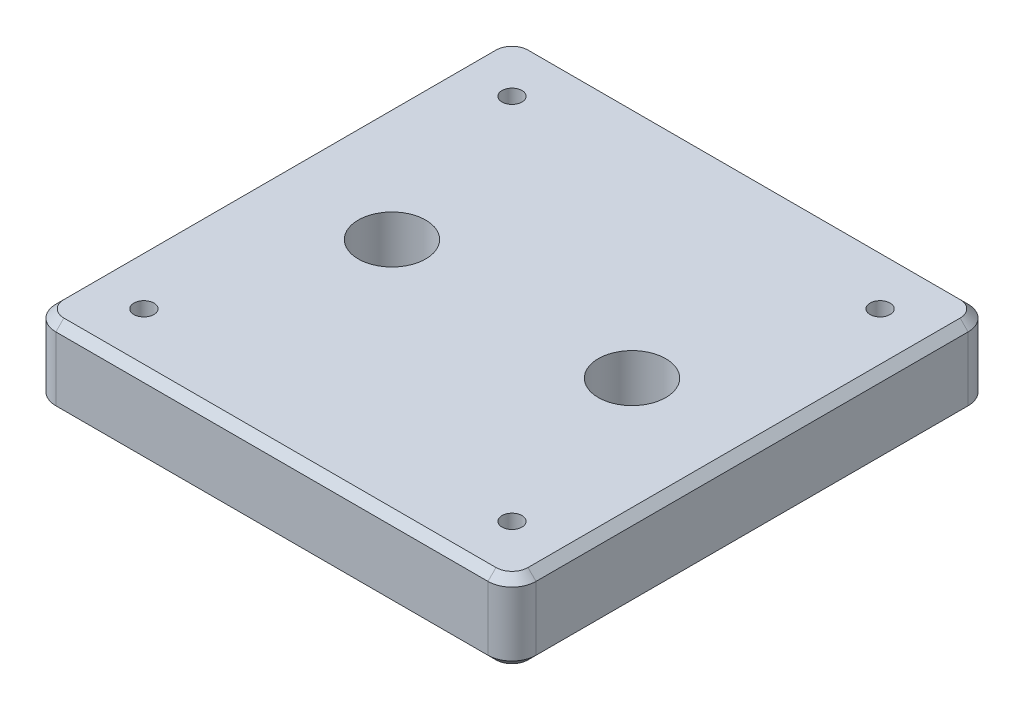
ISO-10303-21;
HEADER;
FILE_DESCRIPTION(('STEP AP214'),'2;1');
FILE_NAME('part.step','',(''),(''),'','','');
FILE_SCHEMA(('AUTOMOTIVE_DESIGN { 1 0 10303 214 1 1 1 1 }'));
ENDSEC;
DATA;
#1=APPLICATION_CONTEXT('core data for automotive mechanical design processes');
#2=APPLICATION_PROTOCOL_DEFINITION('international standard','automotive_design',2000,#1);
#3=PRODUCT_CONTEXT('',#1,'mechanical');
#4=PRODUCT('Part','Part','',(#3));
#5=PRODUCT_RELATED_PRODUCT_CATEGORY('part','',(#4));
#6=PRODUCT_DEFINITION_FORMATION('','',#4);
#7=PRODUCT_DEFINITION_CONTEXT('part definition',#1,'design');
#8=PRODUCT_DEFINITION('design','',#6,#7);
#9=PRODUCT_DEFINITION_SHAPE('','',#8);
#10=(LENGTH_UNIT() NAMED_UNIT(*) SI_UNIT(.MILLI.,.METRE.));
#11=(NAMED_UNIT(*) PLANE_ANGLE_UNIT() SI_UNIT($,.RADIAN.));
#12=(NAMED_UNIT(*) SI_UNIT($,.STERADIAN.) SOLID_ANGLE_UNIT());
#13=UNCERTAINTY_MEASURE_WITH_UNIT(LENGTH_MEASURE(1.E-05),#10,'distance_accuracy_value','');
#14=(GEOMETRIC_REPRESENTATION_CONTEXT(3) GLOBAL_UNCERTAINTY_ASSIGNED_CONTEXT((#13)) GLOBAL_UNIT_ASSIGNED_CONTEXT((#10,
#11,#12)) REPRESENTATION_CONTEXT('',''));
#15=CARTESIAN_POINT('',(0.,0.,0.));
#16=DIRECTION('',(0.,0.,1.));
#17=DIRECTION('',(1.,0.,0.));
#18=AXIS2_PLACEMENT_3D('',#15,#16,#17);
#19=CARTESIAN_POINT('',(30.,10.,30.));
#20=DIRECTION('',(-1.,0.,0.));
#21=DIRECTION('',(0.,0.,1.));
#22=AXIS2_PLACEMENT_3D('',#19,#20,#21);
#23=PLANE('',#22);
#24=DIRECTION('',(0.,-1.,0.));
#25=VECTOR('',#24,1.);
#26=CARTESIAN_POINT('',(30.,10.,-27.));
#27=LINE('',#26,#25);
#28=CARTESIAN_POINT('',(30.,0.999999999999994,-27.));
#29=VERTEX_POINT('',#28);
#30=CARTESIAN_POINT('',(30.,9.00000000000001,-27.));
#31=VERTEX_POINT('',#30);
#32=EDGE_CURVE('E327',#29,#31,#27,.F.);
#33=ORIENTED_EDGE('',*,*,#32,.T.);
#34=DIRECTION('',(0.,0.,1.));
#35=VECTOR('',#34,1.);
#36=CARTESIAN_POINT('',(30.,9.00000000000001,30.));
#37=LINE('',#36,#35);
#38=CARTESIAN_POINT('',(30.,9.00000000000001,27.));
#39=VERTEX_POINT('',#38);
#40=EDGE_CURVE('E306',#31,#39,#37,.T.);
#41=ORIENTED_EDGE('',*,*,#40,.T.);
#42=DIRECTION('',(0.,-1.,0.));
#43=VECTOR('',#42,1.);
#44=CARTESIAN_POINT('',(30.,10.,27.));
#45=LINE('',#44,#43);
#46=CARTESIAN_POINT('',(30.,0.999999999999994,27.));
#47=VERTEX_POINT('',#46);
#48=EDGE_CURVE('E330',#39,#47,#45,.T.);
#49=ORIENTED_EDGE('',*,*,#48,.T.);
#50=DIRECTION('',(0.,0.,-1.));
#51=VECTOR('',#50,1.);
#52=CARTESIAN_POINT('',(30.,0.999999999999994,-27.));
#53=LINE('',#52,#51);
#54=EDGE_CURVE('E309',#47,#29,#53,.T.);
#55=ORIENTED_EDGE('',*,*,#54,.T.);
#56=EDGE_LOOP('',(#33,#41,#49,#55));
#57=FACE_BOUND('',#56,.T.);
#58=ADVANCED_FACE('F49',(#57),#23,.F.);
#59=CARTESIAN_POINT('',(-30.,10.,-30.));
#60=DIRECTION('',(0.,0.,1.));
#61=DIRECTION('',(1.,0.,0.));
#62=AXIS2_PLACEMENT_3D('',#59,#60,#61);
#63=PLANE('',#62);
#64=DIRECTION('',(0.,-1.,0.));
#65=VECTOR('',#64,1.);
#66=CARTESIAN_POINT('',(-27.,10.,-30.));
#67=LINE('',#66,#65);
#68=CARTESIAN_POINT('',(-27.,0.999999999999994,-30.));
#69=VERTEX_POINT('',#68);
#70=CARTESIAN_POINT('',(-27.,9.00000000000001,-30.));
#71=VERTEX_POINT('',#70);
#72=EDGE_CURVE('E332',#69,#71,#67,.F.);
#73=ORIENTED_EDGE('',*,*,#72,.T.);
#74=DIRECTION('',(1.,0.,0.));
#75=VECTOR('',#74,1.);
#76=CARTESIAN_POINT('',(-30.,9.00000000000001,-30.));
#77=LINE('',#76,#75);
#78=CARTESIAN_POINT('',(27.,9.00000000000001,-30.));
#79=VERTEX_POINT('',#78);
#80=EDGE_CURVE('E246',#71,#79,#77,.T.);
#81=ORIENTED_EDGE('',*,*,#80,.T.);
#82=DIRECTION('',(0.,-1.,0.));
#83=VECTOR('',#82,1.);
#84=CARTESIAN_POINT('',(27.,10.,-30.));
#85=LINE('',#84,#83);
#86=CARTESIAN_POINT('',(27.,0.999999999999994,-30.));
#87=VERTEX_POINT('',#86);
#88=EDGE_CURVE('E334',#79,#87,#85,.T.);
#89=ORIENTED_EDGE('',*,*,#88,.T.);
#90=DIRECTION('',(-1.,0.,0.));
#91=VECTOR('',#90,1.);
#92=CARTESIAN_POINT('',(-27.,0.999999999999994,-30.));
#93=LINE('',#92,#91);
#94=EDGE_CURVE('E253',#87,#69,#93,.T.);
#95=ORIENTED_EDGE('',*,*,#94,.T.);
#96=EDGE_LOOP('',(#73,#81,#89,#95));
#97=FACE_BOUND('',#96,.T.);
#98=ADVANCED_FACE('F423',(#97),#63,.F.);
#99=CARTESIAN_POINT('',(-30.,10.,30.));
#100=DIRECTION('',(1.,0.,0.));
#101=DIRECTION('',(0.,0.,-1.));
#102=AXIS2_PLACEMENT_3D('',#99,#100,#101);
#103=PLANE('',#102);
#104=DIRECTION('',(0.,-1.,0.));
#105=VECTOR('',#104,1.);
#106=CARTESIAN_POINT('',(-30.,10.,27.));
#107=LINE('',#106,#105);
#108=CARTESIAN_POINT('',(-30.,0.999999999999994,27.));
#109=VERTEX_POINT('',#108);
#110=CARTESIAN_POINT('',(-30.,9.00000000000001,27.));
#111=VERTEX_POINT('',#110);
#112=EDGE_CURVE('E339',#109,#111,#107,.F.);
#113=ORIENTED_EDGE('',*,*,#112,.T.);
#114=DIRECTION('',(0.,0.,-1.));
#115=VECTOR('',#114,1.);
#116=CARTESIAN_POINT('',(-30.,9.00000000000001,30.));
#117=LINE('',#116,#115);
#118=CARTESIAN_POINT('',(-30.,9.00000000000001,-27.));
#119=VERTEX_POINT('',#118);
#120=EDGE_CURVE('E271',#111,#119,#117,.T.);
#121=ORIENTED_EDGE('',*,*,#120,.T.);
#122=DIRECTION('',(0.,-1.,0.));
#123=VECTOR('',#122,1.);
#124=CARTESIAN_POINT('',(-30.,10.,-27.));
#125=LINE('',#124,#123);
#126=CARTESIAN_POINT('',(-30.,0.999999999999994,-27.));
#127=VERTEX_POINT('',#126);
#128=EDGE_CURVE('E336',#119,#127,#125,.T.);
#129=ORIENTED_EDGE('',*,*,#128,.T.);
#130=DIRECTION('',(0.,0.,1.));
#131=VECTOR('',#130,1.);
#132=CARTESIAN_POINT('',(-30.,0.999999999999994,27.));
#133=LINE('',#132,#131);
#134=EDGE_CURVE('E269',#127,#109,#133,.T.);
#135=ORIENTED_EDGE('',*,*,#134,.T.);
#136=EDGE_LOOP('',(#113,#121,#129,#135));
#137=FACE_BOUND('',#136,.T.);
#138=ADVANCED_FACE('F430',(#137),#103,.F.);
#139=CARTESIAN_POINT('',(-30.,10.,30.));
#140=DIRECTION('',(0.,0.,-1.));
#141=DIRECTION('',(-1.,0.,0.));
#142=AXIS2_PLACEMENT_3D('',#139,#140,#141);
#143=PLANE('',#142);
#144=DIRECTION('',(0.,-1.,0.));
#145=VECTOR('',#144,1.);
#146=CARTESIAN_POINT('',(27.,10.,30.));
#147=LINE('',#146,#145);
#148=CARTESIAN_POINT('',(27.,0.999999999999994,30.));
#149=VERTEX_POINT('',#148);
#150=CARTESIAN_POINT('',(27.,9.00000000000001,30.));
#151=VERTEX_POINT('',#150);
#152=EDGE_CURVE('E188',#149,#151,#147,.F.);
#153=ORIENTED_EDGE('',*,*,#152,.T.);
#154=DIRECTION('',(-1.,0.,0.));
#155=VECTOR('',#154,1.);
#156=CARTESIAN_POINT('',(-30.,9.00000000000001,30.));
#157=LINE('',#156,#155);
#158=CARTESIAN_POINT('',(-27.,9.00000000000001,30.));
#159=VERTEX_POINT('',#158);
#160=EDGE_CURVE('E255',#151,#159,#157,.T.);
#161=ORIENTED_EDGE('',*,*,#160,.T.);
#162=DIRECTION('',(0.,-1.,0.));
#163=VECTOR('',#162,1.);
#164=CARTESIAN_POINT('',(-27.,10.,30.));
#165=LINE('',#164,#163);
#166=CARTESIAN_POINT('',(-27.,0.999999999999994,30.));
#167=VERTEX_POINT('',#166);
#168=EDGE_CURVE('E324',#159,#167,#165,.T.);
#169=ORIENTED_EDGE('',*,*,#168,.T.);
#170=DIRECTION('',(1.,0.,0.));
#171=VECTOR('',#170,1.);
#172=CARTESIAN_POINT('',(27.,0.999999999999994,30.));
#173=LINE('',#172,#171);
#174=EDGE_CURVE('E252',#167,#149,#173,.T.);
#175=ORIENTED_EDGE('',*,*,#174,.T.);
#176=EDGE_LOOP('',(#153,#161,#169,#175));
#177=FACE_BOUND('',#176,.T.);
#178=ADVANCED_FACE('F393',(#177),#143,.F.);
#179=CARTESIAN_POINT('',(0.,10.,0.));
#180=DIRECTION('',(0.,-1.,0.));
#181=DIRECTION('',(0.,0.,-1.));
#182=AXIS2_PLACEMENT_3D('',#179,#180,#181);
#183=PLANE('',#182);
#184=CARTESIAN_POINT('',(27.,10.,27.));
#185=DIRECTION('',(0.,-1.,0.));
#186=DIRECTION('',(0.,0.,-1.));
#187=AXIS2_PLACEMENT_3D('',#184,#185,#186);
#188=CIRCLE('',#187,2.00000000000001);
#189=CARTESIAN_POINT('',(27.,10.,29.));
#190=VERTEX_POINT('',#189);
#191=CARTESIAN_POINT('',(29.,10.,27.));
#192=VERTEX_POINT('',#191);
#193=EDGE_CURVE('E317',#190,#192,#188,.F.);
#194=ORIENTED_EDGE('',*,*,#193,.T.);
#195=DIRECTION('',(0.,0.,-1.));
#196=VECTOR('',#195,1.);
#197=CARTESIAN_POINT('',(29.,10.,0.));
#198=LINE('',#197,#196);
#199=CARTESIAN_POINT('',(29.,10.,-27.));
#200=VERTEX_POINT('',#199);
#201=EDGE_CURVE('E312',#192,#200,#198,.T.);
#202=ORIENTED_EDGE('',*,*,#201,.T.);
#203=CARTESIAN_POINT('',(27.,10.,-27.));
#204=DIRECTION('',(0.,-1.,0.));
#205=DIRECTION('',(0.,0.,-1.));
#206=AXIS2_PLACEMENT_3D('',#203,#204,#205);
#207=CIRCLE('',#206,2.00000000000001);
#208=CARTESIAN_POINT('',(27.,10.,-29.));
#209=VERTEX_POINT('',#208);
#210=EDGE_CURVE('E315',#200,#209,#207,.F.);
#211=ORIENTED_EDGE('',*,*,#210,.T.);
#212=DIRECTION('',(-1.,0.,0.));
#213=VECTOR('',#212,1.);
#214=CARTESIAN_POINT('',(0.,10.,-29.));
#215=LINE('',#214,#213);
#216=CARTESIAN_POINT('',(-27.,10.,-29.));
#217=VERTEX_POINT('',#216);
#218=EDGE_CURVE('E171',#209,#217,#215,.T.);
#219=ORIENTED_EDGE('',*,*,#218,.T.);
#220=CARTESIAN_POINT('',(-27.,10.,-27.));
#221=DIRECTION('',(0.,-1.,0.));
#222=DIRECTION('',(0.,0.,-1.));
#223=AXIS2_PLACEMENT_3D('',#220,#221,#222);
#224=CIRCLE('',#223,2.00000000000001);
#225=CARTESIAN_POINT('',(-29.,10.,-27.));
#226=VERTEX_POINT('',#225);
#227=EDGE_CURVE('E164',#217,#226,#224,.F.);
#228=ORIENTED_EDGE('',*,*,#227,.T.);
#229=DIRECTION('',(0.,0.,1.));
#230=VECTOR('',#229,1.);
#231=CARTESIAN_POINT('',(-29.,10.,0.));
#232=LINE('',#231,#230);
#233=CARTESIAN_POINT('',(-29.,10.,27.));
#234=VERTEX_POINT('',#233);
#235=EDGE_CURVE('E168',#226,#234,#232,.T.);
#236=ORIENTED_EDGE('',*,*,#235,.T.);
#237=CARTESIAN_POINT('',(-27.,10.,27.));
#238=DIRECTION('',(0.,-1.,0.));
#239=DIRECTION('',(0.,0.,-1.));
#240=AXIS2_PLACEMENT_3D('',#237,#238,#239);
#241=CIRCLE('',#240,2.00000000000001);
#242=CARTESIAN_POINT('',(-27.,10.,29.));
#243=VERTEX_POINT('',#242);
#244=EDGE_CURVE('E177',#234,#243,#241,.F.);
#245=ORIENTED_EDGE('',*,*,#244,.T.);
#246=DIRECTION('',(1.,0.,0.));
#247=VECTOR('',#246,1.);
#248=CARTESIAN_POINT('',(0.,10.,29.));
#249=LINE('',#248,#247);
#250=EDGE_CURVE('E176',#243,#190,#249,.T.);
#251=ORIENTED_EDGE('',*,*,#250,.T.);
#252=EDGE_LOOP('',(#194,#202,#211,#219,#228,#236,#245,#251));
#253=FACE_BOUND('',#252,.T.);
#254=CARTESIAN_POINT('',(-15.,10.,0.));
#255=DIRECTION('',(0.,1.,0.));
#256=DIRECTION('',(0.,0.,1.));
#257=AXIS2_PLACEMENT_3D('',#254,#255,#256);
#258=CIRCLE('',#257,4.2164);
#259=CARTESIAN_POINT('',(-15.,10.,4.2164));
#260=VERTEX_POINT('',#259);
#261=EDGE_CURVE('E194',#260,#260,#258,.T.);
#262=ORIENTED_EDGE('',*,*,#261,.F.);
#263=EDGE_LOOP('',(#262));
#264=FACE_BOUND('',#263,.T.);
#265=CARTESIAN_POINT('',(15.,10.,0.));
#266=DIRECTION('',(0.,1.,0.));
#267=DIRECTION('',(0.,0.,1.));
#268=AXIS2_PLACEMENT_3D('',#265,#266,#267);
#269=CIRCLE('',#268,4.2164);
#270=CARTESIAN_POINT('',(15.,10.,4.2164));
#271=VERTEX_POINT('',#270);
#272=EDGE_CURVE('E375',#271,#271,#269,.T.);
#273=ORIENTED_EDGE('',*,*,#272,.F.);
#274=EDGE_LOOP('',(#273));
#275=FACE_BOUND('',#274,.T.);
#276=CARTESIAN_POINT('',(23.,10.,-23.));
#277=DIRECTION('',(0.,1.,0.));
#278=DIRECTION('',(0.,0.,1.));
#279=AXIS2_PLACEMENT_3D('',#276,#277,#278);
#280=CIRCLE('',#279,1.24999999999999);
#281=CARTESIAN_POINT('',(23.,10.,-21.75));
#282=VERTEX_POINT('',#281);
#283=EDGE_CURVE('E363',#282,#282,#280,.T.);
#284=ORIENTED_EDGE('',*,*,#283,.F.);
#285=EDGE_LOOP('',(#284));
#286=FACE_BOUND('',#285,.T.);
#287=CARTESIAN_POINT('',(-23.,10.,23.));
#288=DIRECTION('',(0.,1.,0.));
#289=DIRECTION('',(0.,0.,1.));
#290=AXIS2_PLACEMENT_3D('',#287,#288,#289);
#291=CIRCLE('',#290,1.24999999999999);
#292=CARTESIAN_POINT('',(-23.,10.,24.25));
#293=VERTEX_POINT('',#292);
#294=EDGE_CURVE('E357',#293,#293,#291,.T.);
#295=ORIENTED_EDGE('',*,*,#294,.F.);
#296=EDGE_LOOP('',(#295));
#297=FACE_BOUND('',#296,.T.);
#298=CARTESIAN_POINT('',(-23.,10.,-23.));
#299=DIRECTION('',(0.,1.,0.));
#300=DIRECTION('',(0.,0.,1.));
#301=AXIS2_PLACEMENT_3D('',#298,#299,#300);
#302=CIRCLE('',#301,1.24999999999999);
#303=CARTESIAN_POINT('',(-23.,10.,-21.75));
#304=VERTEX_POINT('',#303);
#305=EDGE_CURVE('E351',#304,#304,#302,.T.);
#306=ORIENTED_EDGE('',*,*,#305,.F.);
#307=EDGE_LOOP('',(#306));
#308=FACE_BOUND('',#307,.T.);
#309=CARTESIAN_POINT('',(23.,10.,23.));
#310=DIRECTION('',(0.,1.,0.));
#311=DIRECTION('',(0.,0.,1.));
#312=AXIS2_PLACEMENT_3D('',#309,#310,#311);
#313=CIRCLE('',#312,1.24999999999999);
#314=CARTESIAN_POINT('',(23.,10.,24.25));
#315=VERTEX_POINT('',#314);
#316=EDGE_CURVE('E345',#315,#315,#313,.T.);
#317=ORIENTED_EDGE('',*,*,#316,.F.);
#318=EDGE_LOOP('',(#317));
#319=FACE_BOUND('',#318,.T.);
#320=ADVANCED_FACE('F166',(#253,#264,#275,#286,#297,#308,#319),#183,.F.);
#321=CARTESIAN_POINT('',(0.,0.,0.));
#322=DIRECTION('',(0.,-1.,0.));
#323=DIRECTION('',(0.,0.,-1.));
#324=AXIS2_PLACEMENT_3D('',#321,#322,#323);
#325=PLANE('',#324);
#326=CARTESIAN_POINT('',(27.,0.,-27.));
#327=DIRECTION('',(0.,-1.,0.));
#328=DIRECTION('',(0.,0.,-1.));
#329=AXIS2_PLACEMENT_3D('',#326,#327,#328);
#330=CIRCLE('',#329,2.00000000000001);
#331=CARTESIAN_POINT('',(27.,0.,-29.));
#332=VERTEX_POINT('',#331);
#333=CARTESIAN_POINT('',(29.,0.,-27.));
#334=VERTEX_POINT('',#333);
#335=EDGE_CURVE('E59',#332,#334,#330,.T.);
#336=ORIENTED_EDGE('',*,*,#335,.T.);
#337=DIRECTION('',(0.,0.,1.));
#338=VECTOR('',#337,1.);
#339=CARTESIAN_POINT('',(29.,0.,27.));
#340=LINE('',#339,#338);
#341=CARTESIAN_POINT('',(29.,0.,27.));
#342=VERTEX_POINT('',#341);
#343=EDGE_CURVE('E11',#334,#342,#340,.T.);
#344=ORIENTED_EDGE('',*,*,#343,.T.);
#345=CARTESIAN_POINT('',(27.,0.,27.));
#346=DIRECTION('',(0.,-1.,0.));
#347=DIRECTION('',(0.,0.,-1.));
#348=AXIS2_PLACEMENT_3D('',#345,#346,#347);
#349=CIRCLE('',#348,2.00000000000001);
#350=CARTESIAN_POINT('',(27.,0.,29.));
#351=VERTEX_POINT('',#350);
#352=EDGE_CURVE('E283',#342,#351,#349,.T.);
#353=ORIENTED_EDGE('',*,*,#352,.T.);
#354=DIRECTION('',(-1.,0.,0.));
#355=VECTOR('',#354,1.);
#356=CARTESIAN_POINT('',(-27.,0.,29.));
#357=LINE('',#356,#355);
#358=CARTESIAN_POINT('',(-27.,0.,29.));
#359=VERTEX_POINT('',#358);
#360=EDGE_CURVE('E279',#351,#359,#357,.T.);
#361=ORIENTED_EDGE('',*,*,#360,.T.);
#362=CARTESIAN_POINT('',(-27.,0.,27.));
#363=DIRECTION('',(0.,-1.,0.));
#364=DIRECTION('',(0.,0.,-1.));
#365=AXIS2_PLACEMENT_3D('',#362,#363,#364);
#366=CIRCLE('',#365,2.00000000000001);
#367=CARTESIAN_POINT('',(-29.,0.,27.));
#368=VERTEX_POINT('',#367);
#369=EDGE_CURVE('E275',#359,#368,#366,.T.);
#370=ORIENTED_EDGE('',*,*,#369,.T.);
#371=DIRECTION('',(0.,0.,-1.));
#372=VECTOR('',#371,1.);
#373=CARTESIAN_POINT('',(-29.,0.,-27.));
#374=LINE('',#373,#372);
#375=CARTESIAN_POINT('',(-29.,0.,-27.));
#376=VERTEX_POINT('',#375);
#377=EDGE_CURVE('E273',#368,#376,#374,.T.);
#378=ORIENTED_EDGE('',*,*,#377,.T.);
#379=CARTESIAN_POINT('',(-27.,0.,-27.));
#380=DIRECTION('',(0.,-1.,0.));
#381=DIRECTION('',(0.,0.,-1.));
#382=AXIS2_PLACEMENT_3D('',#379,#380,#381);
#383=CIRCLE('',#382,2.00000000000001);
#384=CARTESIAN_POINT('',(-27.,0.,-29.));
#385=VERTEX_POINT('',#384);
#386=EDGE_CURVE('E277',#376,#385,#383,.T.);
#387=ORIENTED_EDGE('',*,*,#386,.T.);
#388=DIRECTION('',(1.,0.,0.));
#389=VECTOR('',#388,1.);
#390=CARTESIAN_POINT('',(27.,0.,-29.));
#391=LINE('',#390,#389);
#392=EDGE_CURVE('E281',#385,#332,#391,.T.);
#393=ORIENTED_EDGE('',*,*,#392,.T.);
#394=EDGE_LOOP('',(#336,#344,#353,#361,#370,#378,#387,#393));
#395=FACE_BOUND('',#394,.T.);
#396=CARTESIAN_POINT('',(-15.,0.,0.));
#397=DIRECTION('',(0.,1.,0.));
#398=DIRECTION('',(0.,0.,1.));
#399=AXIS2_PLACEMENT_3D('',#396,#397,#398);
#400=CIRCLE('',#399,2.24790000000001);
#401=CARTESIAN_POINT('',(-15.,0.,2.24790000000001));
#402=VERTEX_POINT('',#401);
#403=EDGE_CURVE('E378',#402,#402,#400,.T.);
#404=ORIENTED_EDGE('',*,*,#403,.T.);
#405=EDGE_LOOP('',(#404));
#406=FACE_BOUND('',#405,.T.);
#407=CARTESIAN_POINT('',(15.,0.,0.));
#408=DIRECTION('',(0.,1.,0.));
#409=DIRECTION('',(0.,0.,1.));
#410=AXIS2_PLACEMENT_3D('',#407,#408,#409);
#411=CIRCLE('',#410,2.24790000000001);
#412=CARTESIAN_POINT('',(15.,0.,2.24790000000001));
#413=VERTEX_POINT('',#412);
#414=EDGE_CURVE('E366',#413,#413,#411,.T.);
#415=ORIENTED_EDGE('',*,*,#414,.T.);
#416=EDGE_LOOP('',(#415));
#417=FACE_BOUND('',#416,.T.);
#418=CARTESIAN_POINT('',(23.,0.,-23.));
#419=DIRECTION('',(0.,1.,0.));
#420=DIRECTION('',(0.,0.,1.));
#421=AXIS2_PLACEMENT_3D('',#418,#419,#420);
#422=CIRCLE('',#421,1.24999999999999);
#423=CARTESIAN_POINT('',(23.,0.,-21.75));
#424=VERTEX_POINT('',#423);
#425=EDGE_CURVE('E360',#424,#424,#422,.T.);
#426=ORIENTED_EDGE('',*,*,#425,.T.);
#427=EDGE_LOOP('',(#426));
#428=FACE_BOUND('',#427,.T.);
#429=CARTESIAN_POINT('',(-23.,0.,23.));
#430=DIRECTION('',(0.,1.,0.));
#431=DIRECTION('',(0.,0.,1.));
#432=AXIS2_PLACEMENT_3D('',#429,#430,#431);
#433=CIRCLE('',#432,1.24999999999999);
#434=CARTESIAN_POINT('',(-23.,0.,24.25));
#435=VERTEX_POINT('',#434);
#436=EDGE_CURVE('E354',#435,#435,#433,.T.);
#437=ORIENTED_EDGE('',*,*,#436,.T.);
#438=EDGE_LOOP('',(#437));
#439=FACE_BOUND('',#438,.T.);
#440=CARTESIAN_POINT('',(-23.,0.,-23.));
#441=DIRECTION('',(0.,1.,0.));
#442=DIRECTION('',(0.,0.,1.));
#443=AXIS2_PLACEMENT_3D('',#440,#441,#442);
#444=CIRCLE('',#443,1.24999999999999);
#445=CARTESIAN_POINT('',(-23.,0.,-21.75));
#446=VERTEX_POINT('',#445);
#447=EDGE_CURVE('E348',#446,#446,#444,.T.);
#448=ORIENTED_EDGE('',*,*,#447,.T.);
#449=EDGE_LOOP('',(#448));
#450=FACE_BOUND('',#449,.T.);
#451=CARTESIAN_POINT('',(23.,0.,23.));
#452=DIRECTION('',(0.,1.,0.));
#453=DIRECTION('',(0.,0.,1.));
#454=AXIS2_PLACEMENT_3D('',#451,#452,#453);
#455=CIRCLE('',#454,1.24999999999999);
#456=CARTESIAN_POINT('',(23.,0.,24.25));
#457=VERTEX_POINT('',#456);
#458=EDGE_CURVE('E342',#457,#457,#455,.T.);
#459=ORIENTED_EDGE('',*,*,#458,.T.);
#460=EDGE_LOOP('',(#459));
#461=FACE_BOUND('',#460,.T.);
#462=ADVANCED_FACE('F285',(#395,#406,#417,#428,#439,#450,#461),#325,.T.);
#463=CARTESIAN_POINT('',(-27.,10.,-27.));
#464=DIRECTION('',(0.,-1.,0.));
#465=DIRECTION('',(0.,0.,-1.));
#466=AXIS2_PLACEMENT_3D('',#463,#464,#465);
#467=CYLINDRICAL_SURFACE('',#466,3.);
#468=ORIENTED_EDGE('',*,*,#128,.F.);
#469=CARTESIAN_POINT('',(-27.,9.00000000000001,-27.));
#470=DIRECTION('',(0.,-1.,0.));
#471=DIRECTION('',(0.,0.,-1.));
#472=AXIS2_PLACEMENT_3D('',#469,#470,#471);
#473=CIRCLE('',#472,3.);
#474=EDGE_CURVE('E191',#119,#71,#473,.T.);
#475=ORIENTED_EDGE('',*,*,#474,.T.);
#476=ORIENTED_EDGE('',*,*,#72,.F.);
#477=CARTESIAN_POINT('',(-27.,0.999999999999994,-27.));
#478=DIRECTION('',(0.,-1.,0.));
#479=DIRECTION('',(0.,0.,-1.));
#480=AXIS2_PLACEMENT_3D('',#477,#478,#479);
#481=CIRCLE('',#480,3.);
#482=EDGE_CURVE('E262',#69,#127,#481,.F.);
#483=ORIENTED_EDGE('',*,*,#482,.T.);
#484=EDGE_LOOP('',(#468,#475,#476,#483));
#485=FACE_BOUND('',#484,.T.);
#486=ADVANCED_FACE('F434',(#485),#467,.T.);
#487=CARTESIAN_POINT('',(27.,10.,-27.));
#488=DIRECTION('',(0.,-1.,0.));
#489=DIRECTION('',(0.,0.,-1.));
#490=AXIS2_PLACEMENT_3D('',#487,#488,#489);
#491=CYLINDRICAL_SURFACE('',#490,3.);
#492=ORIENTED_EDGE('',*,*,#88,.F.);
#493=CARTESIAN_POINT('',(27.,9.00000000000001,-27.));
#494=DIRECTION('',(0.,-1.,0.));
#495=DIRECTION('',(0.,0.,-1.));
#496=AXIS2_PLACEMENT_3D('',#493,#494,#495);
#497=CIRCLE('',#496,3.);
#498=EDGE_CURVE('E300',#79,#31,#497,.T.);
#499=ORIENTED_EDGE('',*,*,#498,.T.);
#500=ORIENTED_EDGE('',*,*,#32,.F.);
#501=CARTESIAN_POINT('',(27.,0.999999999999994,-27.));
#502=DIRECTION('',(0.,-1.,0.));
#503=DIRECTION('',(0.,0.,-1.));
#504=AXIS2_PLACEMENT_3D('',#501,#502,#503);
#505=CIRCLE('',#504,3.);
#506=EDGE_CURVE('E302',#29,#87,#505,.F.);
#507=ORIENTED_EDGE('',*,*,#506,.T.);
#508=EDGE_LOOP('',(#492,#499,#500,#507));
#509=FACE_BOUND('',#508,.T.);
#510=ADVANCED_FACE('F437',(#509),#491,.T.);
#511=CARTESIAN_POINT('',(27.,10.,27.));
#512=DIRECTION('',(0.,-1.,0.));
#513=DIRECTION('',(0.,0.,-1.));
#514=AXIS2_PLACEMENT_3D('',#511,#512,#513);
#515=CYLINDRICAL_SURFACE('',#514,3.);
#516=ORIENTED_EDGE('',*,*,#48,.F.);
#517=CARTESIAN_POINT('',(27.,9.00000000000001,27.));
#518=DIRECTION('',(0.,-1.,0.));
#519=DIRECTION('',(0.,0.,-1.));
#520=AXIS2_PLACEMENT_3D('',#517,#518,#519);
#521=CIRCLE('',#520,3.);
#522=EDGE_CURVE('E257',#39,#151,#521,.T.);
#523=ORIENTED_EDGE('',*,*,#522,.T.);
#524=ORIENTED_EDGE('',*,*,#152,.F.);
#525=CARTESIAN_POINT('',(27.,0.999999999999994,27.));
#526=DIRECTION('',(0.,-1.,0.));
#527=DIRECTION('',(0.,0.,-1.));
#528=AXIS2_PLACEMENT_3D('',#525,#526,#527);
#529=CIRCLE('',#528,3.);
#530=EDGE_CURVE('E295',#149,#47,#529,.F.);
#531=ORIENTED_EDGE('',*,*,#530,.T.);
#532=EDGE_LOOP('',(#516,#523,#524,#531));
#533=FACE_BOUND('',#532,.T.);
#534=ADVANCED_FACE('F418',(#533),#515,.T.);
#535=CARTESIAN_POINT('',(-27.,10.,27.));
#536=DIRECTION('',(0.,-1.,0.));
#537=DIRECTION('',(0.,0.,-1.));
#538=AXIS2_PLACEMENT_3D('',#535,#536,#537);
#539=CYLINDRICAL_SURFACE('',#538,3.);
#540=ORIENTED_EDGE('',*,*,#168,.F.);
#541=CARTESIAN_POINT('',(-27.,9.00000000000001,27.));
#542=DIRECTION('',(0.,-1.,0.));
#543=DIRECTION('',(0.,0.,-1.));
#544=AXIS2_PLACEMENT_3D('',#541,#542,#543);
#545=CIRCLE('',#544,3.);
#546=EDGE_CURVE('E267',#159,#111,#545,.T.);
#547=ORIENTED_EDGE('',*,*,#546,.T.);
#548=ORIENTED_EDGE('',*,*,#112,.F.);
#549=CARTESIAN_POINT('',(-27.,0.999999999999994,27.));
#550=DIRECTION('',(0.,-1.,0.));
#551=DIRECTION('',(0.,0.,-1.));
#552=AXIS2_PLACEMENT_3D('',#549,#550,#551);
#553=CIRCLE('',#552,3.);
#554=EDGE_CURVE('E265',#109,#167,#553,.F.);
#555=ORIENTED_EDGE('',*,*,#554,.T.);
#556=EDGE_LOOP('',(#540,#547,#548,#555));
#557=FACE_BOUND('',#556,.T.);
#558=ADVANCED_FACE('F408',(#557),#539,.T.);
#559=CARTESIAN_POINT('',(23.,10.,23.));
#560=DIRECTION('',(0.,1.,0.));
#561=DIRECTION('',(0.,0.,1.));
#562=AXIS2_PLACEMENT_3D('',#559,#560,#561);
#563=CYLINDRICAL_SURFACE('',#562,1.24999999999999);
#564=ORIENTED_EDGE('',*,*,#458,.F.);
#565=EDGE_LOOP('',(#564));
#566=FACE_BOUND('',#565,.T.);
#567=ORIENTED_EDGE('',*,*,#316,.T.);
#568=EDGE_LOOP('',(#567));
#569=FACE_BOUND('',#568,.T.);
#570=ADVANCED_FACE('F405',(#566,#569),#563,.F.);
#571=CARTESIAN_POINT('',(-23.,10.,-23.));
#572=DIRECTION('',(0.,1.,0.));
#573=DIRECTION('',(0.,0.,1.));
#574=AXIS2_PLACEMENT_3D('',#571,#572,#573);
#575=CYLINDRICAL_SURFACE('',#574,1.24999999999999);
#576=ORIENTED_EDGE('',*,*,#447,.F.);
#577=EDGE_LOOP('',(#576));
#578=FACE_BOUND('',#577,.T.);
#579=ORIENTED_EDGE('',*,*,#305,.T.);
#580=EDGE_LOOP('',(#579));
#581=FACE_BOUND('',#580,.T.);
#582=ADVANCED_FACE('F407',(#578,#581),#575,.F.);
#583=CARTESIAN_POINT('',(-23.,10.,23.));
#584=DIRECTION('',(0.,1.,0.));
#585=DIRECTION('',(0.,0.,1.));
#586=AXIS2_PLACEMENT_3D('',#583,#584,#585);
#587=CYLINDRICAL_SURFACE('',#586,1.24999999999999);
#588=ORIENTED_EDGE('',*,*,#436,.F.);
#589=EDGE_LOOP('',(#588));
#590=FACE_BOUND('',#589,.T.);
#591=ORIENTED_EDGE('',*,*,#294,.T.);
#592=EDGE_LOOP('',(#591));
#593=FACE_BOUND('',#592,.T.);
#594=ADVANCED_FACE('F414',(#590,#593),#587,.F.);
#595=CARTESIAN_POINT('',(23.,10.,-23.));
#596=DIRECTION('',(0.,1.,0.));
#597=DIRECTION('',(0.,0.,1.));
#598=AXIS2_PLACEMENT_3D('',#595,#596,#597);
#599=CYLINDRICAL_SURFACE('',#598,1.24999999999999);
#600=ORIENTED_EDGE('',*,*,#425,.F.);
#601=EDGE_LOOP('',(#600));
#602=FACE_BOUND('',#601,.T.);
#603=ORIENTED_EDGE('',*,*,#283,.T.);
#604=EDGE_LOOP('',(#603));
#605=FACE_BOUND('',#604,.T.);
#606=ADVANCED_FACE('F739',(#602,#605),#599,.F.);
#607=CARTESIAN_POINT('',(15.,10.,0.));
#608=DIRECTION('',(0.,1.,0.));
#609=DIRECTION('',(0.,0.,1.));
#610=AXIS2_PLACEMENT_3D('',#607,#608,#609);
#611=CYLINDRICAL_SURFACE('',#610,2.2479);
#612=ORIENTED_EDGE('',*,*,#414,.F.);
#613=EDGE_LOOP('',(#612));
#614=FACE_BOUND('',#613,.T.);
#615=CARTESIAN_POINT('',(15.,2.34823237602753,0.));
#616=DIRECTION('',(0.,1.,0.));
#617=DIRECTION('',(0.,0.,1.));
#618=AXIS2_PLACEMENT_3D('',#615,#616,#617);
#619=CIRCLE('',#618,2.2479);
#620=CARTESIAN_POINT('',(15.,2.34823237602753,2.2479));
#621=VERTEX_POINT('',#620);
#622=EDGE_CURVE('E369',#621,#621,#619,.T.);
#623=ORIENTED_EDGE('',*,*,#622,.T.);
#624=EDGE_LOOP('',(#623));
#625=FACE_BOUND('',#624,.T.);
#626=ADVANCED_FACE('F730',(#614,#625),#611,.F.);
#627=CARTESIAN_POINT('',(15.,4.,0.));
#628=DIRECTION('',(0.,1.,0.));
#629=DIRECTION('',(0.,0.,1.));
#630=AXIS2_PLACEMENT_3D('',#627,#628,#629);
#631=CONICAL_SURFACE('',#630,4.2164,0.872664625997165);
#632=ORIENTED_EDGE('',*,*,#622,.F.);
#633=EDGE_LOOP('',(#632));
#634=FACE_BOUND('',#633,.T.);
#635=CARTESIAN_POINT('',(15.,4.,0.));
#636=DIRECTION('',(0.,1.,0.));
#637=DIRECTION('',(0.,0.,1.));
#638=AXIS2_PLACEMENT_3D('',#635,#636,#637);
#639=CIRCLE('',#638,4.2164);
#640=CARTESIAN_POINT('',(15.,4.,4.2164));
#641=VERTEX_POINT('',#640);
#642=EDGE_CURVE('E372',#641,#641,#639,.T.);
#643=ORIENTED_EDGE('',*,*,#642,.T.);
#644=EDGE_LOOP('',(#643));
#645=FACE_BOUND('',#644,.T.);
#646=ADVANCED_FACE('F721',(#634,#645),#631,.F.);
#647=CARTESIAN_POINT('',(15.,10.,0.));
#648=DIRECTION('',(0.,1.,0.));
#649=DIRECTION('',(0.,0.,1.));
#650=AXIS2_PLACEMENT_3D('',#647,#648,#649);
#651=CYLINDRICAL_SURFACE('',#650,4.2164);
#652=ORIENTED_EDGE('',*,*,#642,.F.);
#653=EDGE_LOOP('',(#652));
#654=FACE_BOUND('',#653,.T.);
#655=ORIENTED_EDGE('',*,*,#272,.T.);
#656=EDGE_LOOP('',(#655));
#657=FACE_BOUND('',#656,.T.);
#658=ADVANCED_FACE('F712',(#654,#657),#651,.F.);
#659=CARTESIAN_POINT('',(-15.,10.,0.));
#660=DIRECTION('',(0.,1.,0.));
#661=DIRECTION('',(0.,0.,1.));
#662=AXIS2_PLACEMENT_3D('',#659,#660,#661);
#663=CYLINDRICAL_SURFACE('',#662,2.2479);
#664=ORIENTED_EDGE('',*,*,#403,.F.);
#665=EDGE_LOOP('',(#664));
#666=FACE_BOUND('',#665,.T.);
#667=CARTESIAN_POINT('',(-15.,2.34823237602753,0.));
#668=DIRECTION('',(0.,1.,0.));
#669=DIRECTION('',(0.,0.,1.));
#670=AXIS2_PLACEMENT_3D('',#667,#668,#669);
#671=CIRCLE('',#670,2.2479);
#672=CARTESIAN_POINT('',(-15.,2.34823237602753,2.2479));
#673=VERTEX_POINT('',#672);
#674=EDGE_CURVE('E381',#673,#673,#671,.T.);
#675=ORIENTED_EDGE('',*,*,#674,.T.);
#676=EDGE_LOOP('',(#675));
#677=FACE_BOUND('',#676,.T.);
#678=ADVANCED_FACE('F703',(#666,#677),#663,.F.);
#679=CARTESIAN_POINT('',(-15.,4.,0.));
#680=DIRECTION('',(0.,1.,0.));
#681=DIRECTION('',(0.,0.,1.));
#682=AXIS2_PLACEMENT_3D('',#679,#680,#681);
#683=CONICAL_SURFACE('',#682,4.2164,0.872664625997165);
#684=ORIENTED_EDGE('',*,*,#674,.F.);
#685=EDGE_LOOP('',(#684));
#686=FACE_BOUND('',#685,.T.);
#687=CARTESIAN_POINT('',(-15.,4.,0.));
#688=DIRECTION('',(0.,1.,0.));
#689=DIRECTION('',(0.,0.,1.));
#690=AXIS2_PLACEMENT_3D('',#687,#688,#689);
#691=CIRCLE('',#690,4.2164);
#692=CARTESIAN_POINT('',(-15.,4.,4.2164));
#693=VERTEX_POINT('',#692);
#694=EDGE_CURVE('E384',#693,#693,#691,.T.);
#695=ORIENTED_EDGE('',*,*,#694,.T.);
#696=EDGE_LOOP('',(#695));
#697=FACE_BOUND('',#696,.T.);
#698=ADVANCED_FACE('F694',(#686,#697),#683,.F.);
#699=CARTESIAN_POINT('',(-15.,10.,0.));
#700=DIRECTION('',(0.,1.,0.));
#701=DIRECTION('',(0.,0.,1.));
#702=AXIS2_PLACEMENT_3D('',#699,#700,#701);
#703=CYLINDRICAL_SURFACE('',#702,4.2164);
#704=ORIENTED_EDGE('',*,*,#694,.F.);
#705=EDGE_LOOP('',(#704));
#706=FACE_BOUND('',#705,.T.);
#707=ORIENTED_EDGE('',*,*,#261,.T.);
#708=EDGE_LOOP('',(#707));
#709=FACE_BOUND('',#708,.T.);
#710=ADVANCED_FACE('F390',(#706,#709),#703,.F.);
#711=CARTESIAN_POINT('',(-29.,10.,0.));
#712=DIRECTION('',(0.707106781186547,-0.707106781186547,0.));
#713=DIRECTION('',(0.,0.,1.));
#714=AXIS2_PLACEMENT_3D('',#711,#712,#713);
#715=PLANE('',#714);
#716=DIRECTION('',(0.707106781186547,0.707106781186547,0.));
#717=VECTOR('',#716,1.);
#718=CARTESIAN_POINT('',(-30.,9.00000000000001,-27.));
#719=LINE('',#718,#717);
#720=EDGE_CURVE('E183',#119,#226,#719,.T.);
#721=ORIENTED_EDGE('',*,*,#720,.F.);
#722=ORIENTED_EDGE('',*,*,#120,.F.);
#723=DIRECTION('',(-0.707106781186547,-0.707106781186547,0.));
#724=VECTOR('',#723,1.);
#725=CARTESIAN_POINT('',(-29.,10.,27.));
#726=LINE('',#725,#724);
#727=EDGE_CURVE('E186',#234,#111,#726,.T.);
#728=ORIENTED_EDGE('',*,*,#727,.F.);
#729=ORIENTED_EDGE('',*,*,#235,.F.);
#730=EDGE_LOOP('',(#721,#722,#728,#729));
#731=FACE_BOUND('',#730,.T.);
#732=ADVANCED_FACE('F181',(#731),#715,.F.);
#733=CARTESIAN_POINT('',(-27.,10.,27.));
#734=DIRECTION('',(0.,-1.,0.));
#735=DIRECTION('',(0.,0.,-1.));
#736=AXIS2_PLACEMENT_3D('',#733,#734,#735);
#737=CONICAL_SURFACE('',#736,2.00000000000001,0.785398163397449);
#738=ORIENTED_EDGE('',*,*,#727,.T.);
#739=ORIENTED_EDGE('',*,*,#546,.F.);
#740=DIRECTION('',(0.,-0.707106781186547,0.707106781186547));
#741=VECTOR('',#740,1.);
#742=CARTESIAN_POINT('',(-27.,10.,29.));
#743=LINE('',#742,#741);
#744=EDGE_CURVE('E192',#243,#159,#743,.T.);
#745=ORIENTED_EDGE('',*,*,#744,.F.);
#746=ORIENTED_EDGE('',*,*,#244,.F.);
#747=EDGE_LOOP('',(#738,#739,#745,#746));
#748=FACE_BOUND('',#747,.T.);
#749=ADVANCED_FACE('F482',(#748),#737,.T.);
#750=CARTESIAN_POINT('',(-27.,10.,-27.));
#751=DIRECTION('',(0.,-1.,0.));
#752=DIRECTION('',(0.,0.,-1.));
#753=AXIS2_PLACEMENT_3D('',#750,#751,#752);
#754=CONICAL_SURFACE('',#753,2.00000000000001,0.785398163397449);
#755=ORIENTED_EDGE('',*,*,#720,.T.);
#756=ORIENTED_EDGE('',*,*,#227,.F.);
#757=DIRECTION('',(0.,0.707106781186547,0.707106781186547));
#758=VECTOR('',#757,1.);
#759=CARTESIAN_POINT('',(-27.,9.00000000000001,-30.));
#760=LINE('',#759,#758);
#761=EDGE_CURVE('E197',#71,#217,#760,.T.);
#762=ORIENTED_EDGE('',*,*,#761,.F.);
#763=ORIENTED_EDGE('',*,*,#474,.F.);
#764=EDGE_LOOP('',(#755,#756,#762,#763));
#765=FACE_BOUND('',#764,.T.);
#766=ADVANCED_FACE('F190',(#765),#754,.T.);
#767=CARTESIAN_POINT('',(0.,10.,29.));
#768=DIRECTION('',(0.,-0.707106781186547,-0.707106781186547));
#769=DIRECTION('',(1.,0.,0.));
#770=AXIS2_PLACEMENT_3D('',#767,#768,#769);
#771=PLANE('',#770);
#772=ORIENTED_EDGE('',*,*,#744,.T.);
#773=ORIENTED_EDGE('',*,*,#160,.F.);
#774=DIRECTION('',(0.,-0.707106781186547,0.707106781186547));
#775=VECTOR('',#774,1.);
#776=CARTESIAN_POINT('',(27.,10.,29.));
#777=LINE('',#776,#775);
#778=EDGE_CURVE('E240',#190,#151,#777,.T.);
#779=ORIENTED_EDGE('',*,*,#778,.F.);
#780=ORIENTED_EDGE('',*,*,#250,.F.);
#781=EDGE_LOOP('',(#772,#773,#779,#780));
#782=FACE_BOUND('',#781,.T.);
#783=ADVANCED_FACE('F470',(#782),#771,.F.);
#784=CARTESIAN_POINT('',(0.,10.,-29.));
#785=DIRECTION('',(0.,-0.707106781186547,0.707106781186547));
#786=DIRECTION('',(-1.,0.,0.));
#787=AXIS2_PLACEMENT_3D('',#784,#785,#786);
#788=PLANE('',#787);
#789=ORIENTED_EDGE('',*,*,#761,.T.);
#790=ORIENTED_EDGE('',*,*,#218,.F.);
#791=DIRECTION('',(0.,0.707106781186547,0.707106781186547));
#792=VECTOR('',#791,1.);
#793=CARTESIAN_POINT('',(27.,9.00000000000001,-30.));
#794=LINE('',#793,#792);
#795=EDGE_CURVE('E234',#79,#209,#794,.T.);
#796=ORIENTED_EDGE('',*,*,#795,.F.);
#797=ORIENTED_EDGE('',*,*,#80,.F.);
#798=EDGE_LOOP('',(#789,#790,#796,#797));
#799=FACE_BOUND('',#798,.T.);
#800=ADVANCED_FACE('F244',(#799),#788,.F.);
#801=CARTESIAN_POINT('',(27.,10.,27.));
#802=DIRECTION('',(0.,-1.,0.));
#803=DIRECTION('',(0.,0.,-1.));
#804=AXIS2_PLACEMENT_3D('',#801,#802,#803);
#805=CONICAL_SURFACE('',#804,2.00000000000001,0.785398163397449);
#806=ORIENTED_EDGE('',*,*,#778,.T.);
#807=ORIENTED_EDGE('',*,*,#522,.F.);
#808=DIRECTION('',(0.707106781186547,-0.707106781186547,0.));
#809=VECTOR('',#808,1.);
#810=CARTESIAN_POINT('',(29.,10.,27.));
#811=LINE('',#810,#809);
#812=EDGE_CURVE('E227',#192,#39,#811,.T.);
#813=ORIENTED_EDGE('',*,*,#812,.F.);
#814=ORIENTED_EDGE('',*,*,#193,.F.);
#815=EDGE_LOOP('',(#806,#807,#813,#814));
#816=FACE_BOUND('',#815,.T.);
#817=ADVANCED_FACE('F457',(#816),#805,.T.);
#818=CARTESIAN_POINT('',(27.,10.,-27.));
#819=DIRECTION('',(0.,-1.,0.));
#820=DIRECTION('',(0.,0.,-1.));
#821=AXIS2_PLACEMENT_3D('',#818,#819,#820);
#822=CONICAL_SURFACE('',#821,2.00000000000001,0.785398163397449);
#823=ORIENTED_EDGE('',*,*,#795,.T.);
#824=ORIENTED_EDGE('',*,*,#210,.F.);
#825=DIRECTION('',(-0.707106781186547,0.707106781186547,0.));
#826=VECTOR('',#825,1.);
#827=CARTESIAN_POINT('',(30.,9.00000000000001,-27.));
#828=LINE('',#827,#826);
#829=EDGE_CURVE('E222',#31,#200,#828,.T.);
#830=ORIENTED_EDGE('',*,*,#829,.F.);
#831=ORIENTED_EDGE('',*,*,#498,.F.);
#832=EDGE_LOOP('',(#823,#824,#830,#831));
#833=FACE_BOUND('',#832,.T.);
#834=ADVANCED_FACE('F451',(#833),#822,.T.);
#835=CARTESIAN_POINT('',(29.,10.,0.));
#836=DIRECTION('',(-0.707106781186547,-0.707106781186547,0.));
#837=DIRECTION('',(0.,0.,-1.));
#838=AXIS2_PLACEMENT_3D('',#835,#836,#837);
#839=PLANE('',#838);
#840=ORIENTED_EDGE('',*,*,#812,.T.);
#841=ORIENTED_EDGE('',*,*,#40,.F.);
#842=ORIENTED_EDGE('',*,*,#829,.T.);
#843=ORIENTED_EDGE('',*,*,#201,.F.);
#844=EDGE_LOOP('',(#840,#841,#842,#843));
#845=FACE_BOUND('',#844,.T.);
#846=ADVANCED_FACE('F445',(#845),#839,.F.);
#847=CARTESIAN_POINT('',(-30.,0.999999999999994,30.));
#848=DIRECTION('',(-0.707106781186547,-0.707106781186547,0.));
#849=DIRECTION('',(0.,0.,-1.));
#850=AXIS2_PLACEMENT_3D('',#847,#848,#849);
#851=PLANE('',#850);
#852=DIRECTION('',(-0.707106781186547,0.707106781186547,0.));
#853=VECTOR('',#852,1.);
#854=CARTESIAN_POINT('',(-29.,0.,-27.));
#855=LINE('',#854,#853);
#856=EDGE_CURVE('E215',#376,#127,#855,.T.);
#857=ORIENTED_EDGE('',*,*,#856,.F.);
#858=ORIENTED_EDGE('',*,*,#377,.F.);
#859=DIRECTION('',(0.707106781186547,-0.707106781186547,0.));
#860=VECTOR('',#859,1.);
#861=CARTESIAN_POINT('',(-30.,0.999999999999994,27.));
#862=LINE('',#861,#860);
#863=EDGE_CURVE('E54',#109,#368,#862,.T.);
#864=ORIENTED_EDGE('',*,*,#863,.F.);
#865=ORIENTED_EDGE('',*,*,#134,.F.);
#866=EDGE_LOOP('',(#857,#858,#864,#865));
#867=FACE_BOUND('',#866,.T.);
#868=ADVANCED_FACE('F52',(#867),#851,.T.);
#869=CARTESIAN_POINT('',(-27.,0.,27.));
#870=DIRECTION('',(0.,1.,0.));
#871=DIRECTION('',(0.,0.,1.));
#872=AXIS2_PLACEMENT_3D('',#869,#870,#871);
#873=CONICAL_SURFACE('',#872,2.00000000000001,0.785398163397449);
#874=ORIENTED_EDGE('',*,*,#863,.T.);
#875=ORIENTED_EDGE('',*,*,#369,.F.);
#876=DIRECTION('',(0.,-0.707106781186547,-0.707106781186547));
#877=VECTOR('',#876,1.);
#878=CARTESIAN_POINT('',(-27.,0.999999999999994,30.));
#879=LINE('',#878,#877);
#880=EDGE_CURVE('E213',#167,#359,#879,.T.);
#881=ORIENTED_EDGE('',*,*,#880,.F.);
#882=ORIENTED_EDGE('',*,*,#554,.F.);
#883=EDGE_LOOP('',(#874,#875,#881,#882));
#884=FACE_BOUND('',#883,.T.);
#885=ADVANCED_FACE('F529',(#884),#873,.T.);
#886=CARTESIAN_POINT('',(-27.,0.,-27.));
#887=DIRECTION('',(0.,1.,0.));
#888=DIRECTION('',(0.,0.,1.));
#889=AXIS2_PLACEMENT_3D('',#886,#887,#888);
#890=CONICAL_SURFACE('',#889,2.00000000000001,0.785398163397449);
#891=ORIENTED_EDGE('',*,*,#856,.T.);
#892=ORIENTED_EDGE('',*,*,#482,.F.);
#893=DIRECTION('',(0.,0.707106781186547,-0.707106781186547));
#894=VECTOR('',#893,1.);
#895=CARTESIAN_POINT('',(-27.,0.,-29.));
#896=LINE('',#895,#894);
#897=EDGE_CURVE('E210',#385,#69,#896,.T.);
#898=ORIENTED_EDGE('',*,*,#897,.F.);
#899=ORIENTED_EDGE('',*,*,#386,.F.);
#900=EDGE_LOOP('',(#891,#892,#898,#899));
#901=FACE_BOUND('',#900,.T.);
#902=ADVANCED_FACE('F524',(#901),#890,.T.);
#903=CARTESIAN_POINT('',(-30.,0.999999999999994,30.));
#904=DIRECTION('',(0.,-0.707106781186547,0.707106781186547));
#905=DIRECTION('',(-1.,0.,0.));
#906=AXIS2_PLACEMENT_3D('',#903,#904,#905);
#907=PLANE('',#906);
#908=ORIENTED_EDGE('',*,*,#880,.T.);
#909=ORIENTED_EDGE('',*,*,#360,.F.);
#910=DIRECTION('',(0.,-0.707106781186547,-0.707106781186547));
#911=VECTOR('',#910,1.);
#912=CARTESIAN_POINT('',(27.,0.999999999999994,30.));
#913=LINE('',#912,#911);
#914=EDGE_CURVE('E207',#149,#351,#913,.T.);
#915=ORIENTED_EDGE('',*,*,#914,.F.);
#916=ORIENTED_EDGE('',*,*,#174,.F.);
#917=EDGE_LOOP('',(#908,#909,#915,#916));
#918=FACE_BOUND('',#917,.T.);
#919=ADVANCED_FACE('F290',(#918),#907,.T.);
#920=CARTESIAN_POINT('',(-30.,0.999999999999994,-30.));
#921=DIRECTION('',(0.,-0.707106781186547,-0.707106781186547));
#922=DIRECTION('',(1.,0.,0.));
#923=AXIS2_PLACEMENT_3D('',#920,#921,#922);
#924=PLANE('',#923);
#925=ORIENTED_EDGE('',*,*,#897,.T.);
#926=ORIENTED_EDGE('',*,*,#94,.F.);
#927=DIRECTION('',(0.,0.707106781186547,-0.707106781186547));
#928=VECTOR('',#927,1.);
#929=CARTESIAN_POINT('',(27.,0.,-29.));
#930=LINE('',#929,#928);
#931=EDGE_CURVE('E204',#332,#87,#930,.T.);
#932=ORIENTED_EDGE('',*,*,#931,.F.);
#933=ORIENTED_EDGE('',*,*,#392,.F.);
#934=EDGE_LOOP('',(#925,#926,#932,#933));
#935=FACE_BOUND('',#934,.T.);
#936=ADVANCED_FACE('F512',(#935),#924,.T.);
#937=CARTESIAN_POINT('',(27.,0.,27.));
#938=DIRECTION('',(0.,1.,0.));
#939=DIRECTION('',(0.,0.,1.));
#940=AXIS2_PLACEMENT_3D('',#937,#938,#939);
#941=CONICAL_SURFACE('',#940,2.00000000000001,0.785398163397449);
#942=ORIENTED_EDGE('',*,*,#914,.T.);
#943=ORIENTED_EDGE('',*,*,#352,.F.);
#944=DIRECTION('',(-0.707106781186547,-0.707106781186547,0.));
#945=VECTOR('',#944,1.);
#946=CARTESIAN_POINT('',(30.,0.999999999999994,27.));
#947=LINE('',#946,#945);
#948=EDGE_CURVE('E72',#47,#342,#947,.T.);
#949=ORIENTED_EDGE('',*,*,#948,.F.);
#950=ORIENTED_EDGE('',*,*,#530,.F.);
#951=EDGE_LOOP('',(#942,#943,#949,#950));
#952=FACE_BOUND('',#951,.T.);
#953=ADVANCED_FACE('F294',(#952),#941,.T.);
#954=CARTESIAN_POINT('',(27.,0.,-27.));
#955=DIRECTION('',(0.,1.,0.));
#956=DIRECTION('',(0.,0.,1.));
#957=AXIS2_PLACEMENT_3D('',#954,#955,#956);
#958=CONICAL_SURFACE('',#957,2.00000000000001,0.785398163397449);
#959=ORIENTED_EDGE('',*,*,#931,.T.);
#960=ORIENTED_EDGE('',*,*,#506,.F.);
#961=DIRECTION('',(0.707106781186547,0.707106781186547,0.));
#962=VECTOR('',#961,1.);
#963=CARTESIAN_POINT('',(29.,0.,-27.));
#964=LINE('',#963,#962);
#965=EDGE_CURVE('E201',#334,#29,#964,.T.);
#966=ORIENTED_EDGE('',*,*,#965,.F.);
#967=ORIENTED_EDGE('',*,*,#335,.F.);
#968=EDGE_LOOP('',(#959,#960,#966,#967));
#969=FACE_BOUND('',#968,.T.);
#970=ADVANCED_FACE('F500',(#969),#958,.T.);
#971=CARTESIAN_POINT('',(30.,0.999999999999994,30.));
#972=DIRECTION('',(0.707106781186547,-0.707106781186547,0.));
#973=DIRECTION('',(0.,0.,1.));
#974=AXIS2_PLACEMENT_3D('',#971,#972,#973);
#975=PLANE('',#974);
#976=ORIENTED_EDGE('',*,*,#948,.T.);
#977=ORIENTED_EDGE('',*,*,#343,.F.);
#978=ORIENTED_EDGE('',*,*,#965,.T.);
#979=ORIENTED_EDGE('',*,*,#54,.F.);
#980=EDGE_LOOP('',(#976,#977,#978,#979));
#981=FACE_BOUND('',#980,.T.);
#982=ADVANCED_FACE('F494',(#981),#975,.T.);
#983=CLOSED_SHELL('',(#58,#98,#138,#178,#320,#462,#486,#510,#534,#558,#570,#582,#594,#606,#626,
#646,#658,#678,#698,#710,#732,#749,#766,#783,#800,#817,#834,#846,#868,#885,#902,#919,#936,#953,
#970,#982));
#984=MANIFOLD_SOLID_BREP('B2',#983);
#985=ADVANCED_BREP_SHAPE_REPRESENTATION('',(#18,#984),#14);
#986=SHAPE_DEFINITION_REPRESENTATION(#9,#985);
ENDSEC;
END-ISO-10303-21;
